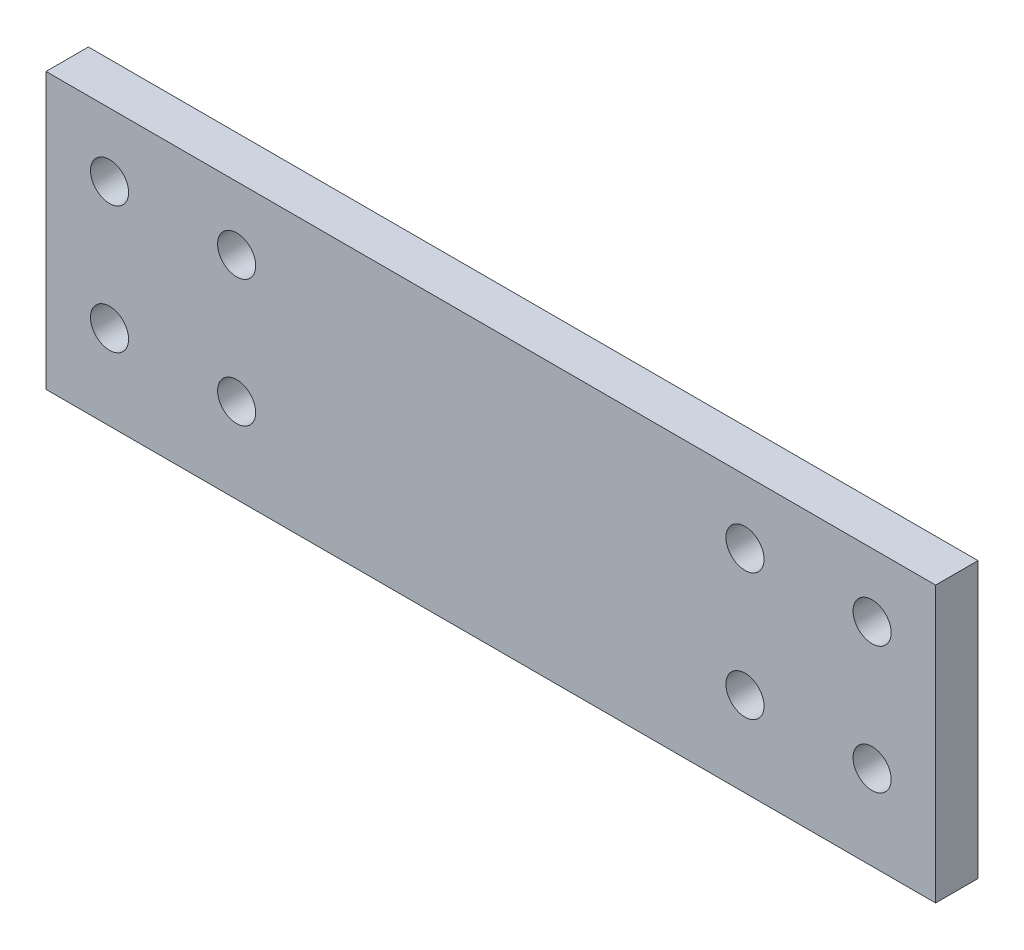
ISO-10303-21;
HEADER;
FILE_DESCRIPTION(('STEP AP214'),'2;1');
FILE_NAME('part.step','',(''),(''),'','','');
FILE_SCHEMA(('AUTOMOTIVE_DESIGN { 1 0 10303 214 1 1 1 1 }'));
ENDSEC;
DATA;
#1=APPLICATION_CONTEXT('core data for automotive mechanical design processes');
#2=APPLICATION_PROTOCOL_DEFINITION('international standard','automotive_design',2000,#1);
#3=PRODUCT_CONTEXT('',#1,'mechanical');
#4=PRODUCT('Part','Part','',(#3));
#5=PRODUCT_RELATED_PRODUCT_CATEGORY('part','',(#4));
#6=PRODUCT_DEFINITION_FORMATION('','',#4);
#7=PRODUCT_DEFINITION_CONTEXT('part definition',#1,'design');
#8=PRODUCT_DEFINITION('design','',#6,#7);
#9=PRODUCT_DEFINITION_SHAPE('','',#8);
#10=(LENGTH_UNIT() NAMED_UNIT(*) SI_UNIT(.MILLI.,.METRE.));
#11=(NAMED_UNIT(*) PLANE_ANGLE_UNIT() SI_UNIT($,.RADIAN.));
#12=(NAMED_UNIT(*) SI_UNIT($,.STERADIAN.) SOLID_ANGLE_UNIT());
#13=UNCERTAINTY_MEASURE_WITH_UNIT(LENGTH_MEASURE(1.E-05),#10,'distance_accuracy_value','');
#14=(GEOMETRIC_REPRESENTATION_CONTEXT(3) GLOBAL_UNCERTAINTY_ASSIGNED_CONTEXT((#13)) GLOBAL_UNIT_ASSIGNED_CONTEXT((#10,
#11,#12)) REPRESENTATION_CONTEXT('',''));
#15=CARTESIAN_POINT('',(0.,0.,0.));
#16=DIRECTION('',(0.,0.,1.));
#17=DIRECTION('',(1.,0.,0.));
#18=AXIS2_PLACEMENT_3D('',#15,#16,#17);
#19=CARTESIAN_POINT('',(-105.,-32.5,10.));
#20=DIRECTION('',(1.,0.,0.));
#21=DIRECTION('',(0.,0.,-1.));
#22=AXIS2_PLACEMENT_3D('',#19,#20,#21);
#23=PLANE('',#22);
#24=DIRECTION('',(0.,-1.,0.));
#25=VECTOR('',#24,1.);
#26=CARTESIAN_POINT('',(-105.,-32.5,0.));
#27=LINE('',#26,#25);
#28=CARTESIAN_POINT('',(-105.,32.5,0.));
#29=VERTEX_POINT('',#28);
#30=CARTESIAN_POINT('',(-105.,-32.5,0.));
#31=VERTEX_POINT('',#30);
#32=EDGE_CURVE('E102',#29,#31,#27,.T.);
#33=ORIENTED_EDGE('',*,*,#32,.T.);
#34=DIRECTION('',(0.,0.,-1.));
#35=VECTOR('',#34,1.);
#36=CARTESIAN_POINT('',(-105.,-32.5,10.));
#37=LINE('',#36,#35);
#38=CARTESIAN_POINT('',(-105.,-32.5,10.));
#39=VERTEX_POINT('',#38);
#40=EDGE_CURVE('E11',#39,#31,#37,.T.);
#41=ORIENTED_EDGE('',*,*,#40,.F.);
#42=DIRECTION('',(0.,-1.,0.));
#43=VECTOR('',#42,1.);
#44=CARTESIAN_POINT('',(-105.,-32.5,10.));
#45=LINE('',#44,#43);
#46=CARTESIAN_POINT('',(-105.,32.5,10.));
#47=VERTEX_POINT('',#46);
#48=EDGE_CURVE('E90',#47,#39,#45,.T.);
#49=ORIENTED_EDGE('',*,*,#48,.F.);
#50=DIRECTION('',(0.,0.,-1.));
#51=VECTOR('',#50,1.);
#52=CARTESIAN_POINT('',(-105.,32.5,10.));
#53=LINE('',#52,#51);
#54=EDGE_CURVE('E98',#47,#29,#53,.T.);
#55=ORIENTED_EDGE('',*,*,#54,.T.);
#56=EDGE_LOOP('',(#33,#41,#49,#55));
#57=FACE_BOUND('',#56,.T.);
#58=ADVANCED_FACE('F39',(#57),#23,.F.);
#59=CARTESIAN_POINT('',(105.,-32.5,10.));
#60=DIRECTION('',(0.,1.,0.));
#61=DIRECTION('',(-1.,0.,0.));
#62=AXIS2_PLACEMENT_3D('',#59,#60,#61);
#63=PLANE('',#62);
#64=DIRECTION('',(1.,0.,0.));
#65=VECTOR('',#64,1.);
#66=CARTESIAN_POINT('',(105.,-32.5,0.));
#67=LINE('',#66,#65);
#68=CARTESIAN_POINT('',(105.,-32.5,0.));
#69=VERTEX_POINT('',#68);
#70=EDGE_CURVE('E94',#31,#69,#67,.T.);
#71=ORIENTED_EDGE('',*,*,#70,.T.);
#72=DIRECTION('',(0.,0.,-1.));
#73=VECTOR('',#72,1.);
#74=CARTESIAN_POINT('',(105.,-32.5,10.));
#75=LINE('',#74,#73);
#76=CARTESIAN_POINT('',(105.,-32.5,10.));
#77=VERTEX_POINT('',#76);
#78=EDGE_CURVE('E47',#77,#69,#75,.T.);
#79=ORIENTED_EDGE('',*,*,#78,.F.);
#80=DIRECTION('',(1.,0.,0.));
#81=VECTOR('',#80,1.);
#82=CARTESIAN_POINT('',(105.,-32.5,10.));
#83=LINE('',#82,#81);
#84=EDGE_CURVE('E85',#39,#77,#83,.T.);
#85=ORIENTED_EDGE('',*,*,#84,.F.);
#86=ORIENTED_EDGE('',*,*,#40,.T.);
#87=EDGE_LOOP('',(#71,#79,#85,#86));
#88=FACE_BOUND('',#87,.T.);
#89=ADVANCED_FACE('F93',(#88),#63,.F.);
#90=CARTESIAN_POINT('',(105.,-32.5,10.));
#91=DIRECTION('',(-1.,0.,0.));
#92=DIRECTION('',(0.,0.,1.));
#93=AXIS2_PLACEMENT_3D('',#90,#91,#92);
#94=PLANE('',#93);
#95=DIRECTION('',(0.,1.,0.));
#96=VECTOR('',#95,1.);
#97=CARTESIAN_POINT('',(105.,-32.5,0.));
#98=LINE('',#97,#96);
#99=CARTESIAN_POINT('',(105.,32.5,0.));
#100=VERTEX_POINT('',#99);
#101=EDGE_CURVE('E72',#69,#100,#98,.T.);
#102=ORIENTED_EDGE('',*,*,#101,.T.);
#103=DIRECTION('',(0.,0.,-1.));
#104=VECTOR('',#103,1.);
#105=CARTESIAN_POINT('',(105.,32.5,10.));
#106=LINE('',#105,#104);
#107=CARTESIAN_POINT('',(105.,32.5,10.));
#108=VERTEX_POINT('',#107);
#109=EDGE_CURVE('E95',#108,#100,#106,.T.);
#110=ORIENTED_EDGE('',*,*,#109,.F.);
#111=DIRECTION('',(0.,1.,0.));
#112=VECTOR('',#111,1.);
#113=CARTESIAN_POINT('',(105.,-32.5,10.));
#114=LINE('',#113,#112);
#115=EDGE_CURVE('E88',#77,#108,#114,.T.);
#116=ORIENTED_EDGE('',*,*,#115,.F.);
#117=ORIENTED_EDGE('',*,*,#78,.T.);
#118=EDGE_LOOP('',(#102,#110,#116,#117));
#119=FACE_BOUND('',#118,.T.);
#120=ADVANCED_FACE('F96',(#119),#94,.F.);
#121=CARTESIAN_POINT('',(105.,32.5,10.));
#122=DIRECTION('',(0.,-1.,0.));
#123=DIRECTION('',(1.,0.,0.));
#124=AXIS2_PLACEMENT_3D('',#121,#122,#123);
#125=PLANE('',#124);
#126=DIRECTION('',(-1.,0.,0.));
#127=VECTOR('',#126,1.);
#128=CARTESIAN_POINT('',(105.,32.5,0.));
#129=LINE('',#128,#127);
#130=EDGE_CURVE('E78',#100,#29,#129,.T.);
#131=ORIENTED_EDGE('',*,*,#130,.T.);
#132=ORIENTED_EDGE('',*,*,#54,.F.);
#133=DIRECTION('',(-1.,0.,0.));
#134=VECTOR('',#133,1.);
#135=CARTESIAN_POINT('',(105.,32.5,10.));
#136=LINE('',#135,#134);
#137=EDGE_CURVE('E55',#108,#47,#136,.T.);
#138=ORIENTED_EDGE('',*,*,#137,.F.);
#139=ORIENTED_EDGE('',*,*,#109,.T.);
#140=EDGE_LOOP('',(#131,#132,#138,#139));
#141=FACE_BOUND('',#140,.T.);
#142=ADVANCED_FACE('F110',(#141),#125,.F.);
#143=CARTESIAN_POINT('',(0.,0.,10.));
#144=DIRECTION('',(0.,0.,1.));
#145=DIRECTION('',(1.,0.,0.));
#146=AXIS2_PLACEMENT_3D('',#143,#144,#145);
#147=PLANE('',#146);
#148=CARTESIAN_POINT('',(60.,17.5,10.));
#149=DIRECTION('',(0.,0.,1.));
#150=DIRECTION('',(1.,0.,0.));
#151=AXIS2_PLACEMENT_3D('',#148,#149,#150);
#152=CIRCLE('',#151,4.5);
#153=CARTESIAN_POINT('',(64.5,17.5,10.));
#154=VERTEX_POINT('',#153);
#155=EDGE_CURVE('E134',#154,#154,#152,.T.);
#156=ORIENTED_EDGE('',*,*,#155,.F.);
#157=EDGE_LOOP('',(#156));
#158=FACE_BOUND('',#157,.T.);
#159=CARTESIAN_POINT('',(-60.,-12.5,10.));
#160=DIRECTION('',(0.,0.,1.));
#161=DIRECTION('',(1.,0.,0.));
#162=AXIS2_PLACEMENT_3D('',#159,#160,#161);
#163=CIRCLE('',#162,4.5);
#164=CARTESIAN_POINT('',(-55.5,-12.5,10.));
#165=VERTEX_POINT('',#164);
#166=EDGE_CURVE('E129',#165,#165,#163,.T.);
#167=ORIENTED_EDGE('',*,*,#166,.F.);
#168=EDGE_LOOP('',(#167));
#169=FACE_BOUND('',#168,.T.);
#170=CARTESIAN_POINT('',(-60.,17.5,10.));
#171=DIRECTION('',(0.,0.,1.));
#172=DIRECTION('',(1.,0.,0.));
#173=AXIS2_PLACEMENT_3D('',#170,#171,#172);
#174=CIRCLE('',#173,4.5);
#175=CARTESIAN_POINT('',(-55.5,17.5,10.));
#176=VERTEX_POINT('',#175);
#177=EDGE_CURVE('E122',#176,#176,#174,.T.);
#178=ORIENTED_EDGE('',*,*,#177,.F.);
#179=EDGE_LOOP('',(#178));
#180=FACE_BOUND('',#179,.T.);
#181=CARTESIAN_POINT('',(-90.,17.5,10.));
#182=DIRECTION('',(0.,0.,1.));
#183=DIRECTION('',(1.,0.,0.));
#184=AXIS2_PLACEMENT_3D('',#181,#182,#183);
#185=CIRCLE('',#184,4.5);
#186=CARTESIAN_POINT('',(-85.5,17.5,10.));
#187=VERTEX_POINT('',#186);
#188=EDGE_CURVE('E121',#187,#187,#185,.T.);
#189=ORIENTED_EDGE('',*,*,#188,.F.);
#190=EDGE_LOOP('',(#189));
#191=FACE_BOUND('',#190,.T.);
#192=CARTESIAN_POINT('',(90.,-12.5,10.));
#193=DIRECTION('',(0.,0.,1.));
#194=DIRECTION('',(1.,0.,0.));
#195=AXIS2_PLACEMENT_3D('',#192,#193,#194);
#196=CIRCLE('',#195,4.5);
#197=CARTESIAN_POINT('',(94.5,-12.5,10.));
#198=VERTEX_POINT('',#197);
#199=EDGE_CURVE('E153',#198,#198,#196,.T.);
#200=ORIENTED_EDGE('',*,*,#199,.F.);
#201=EDGE_LOOP('',(#200));
#202=FACE_BOUND('',#201,.T.);
#203=CARTESIAN_POINT('',(60.,-12.5,10.));
#204=DIRECTION('',(0.,0.,1.));
#205=DIRECTION('',(1.,0.,0.));
#206=AXIS2_PLACEMENT_3D('',#203,#204,#205);
#207=CIRCLE('',#206,4.5);
#208=CARTESIAN_POINT('',(64.5,-12.5,10.));
#209=VERTEX_POINT('',#208);
#210=EDGE_CURVE('E146',#209,#209,#207,.T.);
#211=ORIENTED_EDGE('',*,*,#210,.F.);
#212=EDGE_LOOP('',(#211));
#213=FACE_BOUND('',#212,.T.);
#214=CARTESIAN_POINT('',(90.,17.5,10.));
#215=DIRECTION('',(0.,0.,1.));
#216=DIRECTION('',(1.,0.,0.));
#217=AXIS2_PLACEMENT_3D('',#214,#215,#216);
#218=CIRCLE('',#217,4.5);
#219=CARTESIAN_POINT('',(94.5,17.5,10.));
#220=VERTEX_POINT('',#219);
#221=EDGE_CURVE('E141',#220,#220,#218,.T.);
#222=ORIENTED_EDGE('',*,*,#221,.F.);
#223=EDGE_LOOP('',(#222));
#224=FACE_BOUND('',#223,.T.);
#225=CARTESIAN_POINT('',(-90.,-12.5,10.));
#226=DIRECTION('',(0.,0.,1.));
#227=DIRECTION('',(1.,0.,0.));
#228=AXIS2_PLACEMENT_3D('',#225,#226,#227);
#229=CIRCLE('',#228,4.5);
#230=CARTESIAN_POINT('',(-85.5,-12.5,10.));
#231=VERTEX_POINT('',#230);
#232=EDGE_CURVE('E118',#231,#231,#229,.T.);
#233=ORIENTED_EDGE('',*,*,#232,.F.);
#234=EDGE_LOOP('',(#233));
#235=FACE_BOUND('',#234,.T.);
#236=ORIENTED_EDGE('',*,*,#48,.T.);
#237=ORIENTED_EDGE('',*,*,#84,.T.);
#238=ORIENTED_EDGE('',*,*,#115,.T.);
#239=ORIENTED_EDGE('',*,*,#137,.T.);
#240=EDGE_LOOP('',(#236,#237,#238,#239));
#241=FACE_BOUND('',#240,.T.);
#242=ADVANCED_FACE('F86',(#158,#169,#180,#191,#202,#213,#224,#235,#241),#147,.T.);
#243=CARTESIAN_POINT('',(0.,0.,0.));
#244=DIRECTION('',(0.,0.,1.));
#245=DIRECTION('',(1.,0.,0.));
#246=AXIS2_PLACEMENT_3D('',#243,#244,#245);
#247=PLANE('',#246);
#248=CARTESIAN_POINT('',(60.,17.5,0.));
#249=DIRECTION('',(0.,0.,1.));
#250=DIRECTION('',(1.,0.,0.));
#251=AXIS2_PLACEMENT_3D('',#248,#249,#250);
#252=CIRCLE('',#251,4.5);
#253=CARTESIAN_POINT('',(64.5,17.5,0.));
#254=VERTEX_POINT('',#253);
#255=EDGE_CURVE('E138',#254,#254,#252,.F.);
#256=ORIENTED_EDGE('',*,*,#255,.F.);
#257=EDGE_LOOP('',(#256));
#258=FACE_BOUND('',#257,.T.);
#259=CARTESIAN_POINT('',(-60.,-12.5,0.));
#260=DIRECTION('',(0.,0.,1.));
#261=DIRECTION('',(1.,0.,0.));
#262=AXIS2_PLACEMENT_3D('',#259,#260,#261);
#263=CIRCLE('',#262,4.5);
#264=CARTESIAN_POINT('',(-55.5,-12.5,0.));
#265=VERTEX_POINT('',#264);
#266=EDGE_CURVE('E137',#265,#265,#263,.F.);
#267=ORIENTED_EDGE('',*,*,#266,.F.);
#268=EDGE_LOOP('',(#267));
#269=FACE_BOUND('',#268,.T.);
#270=CARTESIAN_POINT('',(-60.,17.5,0.));
#271=DIRECTION('',(0.,0.,1.));
#272=DIRECTION('',(1.,0.,0.));
#273=AXIS2_PLACEMENT_3D('',#270,#271,#272);
#274=CIRCLE('',#273,4.5);
#275=CARTESIAN_POINT('',(-55.5,17.5,0.));
#276=VERTEX_POINT('',#275);
#277=EDGE_CURVE('E126',#276,#276,#274,.F.);
#278=ORIENTED_EDGE('',*,*,#277,.F.);
#279=EDGE_LOOP('',(#278));
#280=FACE_BOUND('',#279,.T.);
#281=CARTESIAN_POINT('',(-90.,17.5,0.));
#282=DIRECTION('',(0.,0.,1.));
#283=DIRECTION('',(1.,0.,0.));
#284=AXIS2_PLACEMENT_3D('',#281,#282,#283);
#285=CIRCLE('',#284,4.5);
#286=CARTESIAN_POINT('',(-85.5,17.5,0.));
#287=VERTEX_POINT('',#286);
#288=EDGE_CURVE('E125',#287,#287,#285,.F.);
#289=ORIENTED_EDGE('',*,*,#288,.F.);
#290=EDGE_LOOP('',(#289));
#291=FACE_BOUND('',#290,.T.);
#292=CARTESIAN_POINT('',(90.,-12.5,0.));
#293=DIRECTION('',(0.,0.,1.));
#294=DIRECTION('',(1.,0.,0.));
#295=AXIS2_PLACEMENT_3D('',#292,#293,#294);
#296=CIRCLE('',#295,4.5);
#297=CARTESIAN_POINT('',(94.5,-12.5,0.));
#298=VERTEX_POINT('',#297);
#299=EDGE_CURVE('E160',#298,#298,#296,.F.);
#300=ORIENTED_EDGE('',*,*,#299,.F.);
#301=EDGE_LOOP('',(#300));
#302=FACE_BOUND('',#301,.T.);
#303=CARTESIAN_POINT('',(60.,-12.5,0.));
#304=DIRECTION('',(0.,0.,1.));
#305=DIRECTION('',(1.,0.,0.));
#306=AXIS2_PLACEMENT_3D('',#303,#304,#305);
#307=CIRCLE('',#306,4.5);
#308=CARTESIAN_POINT('',(64.5,-12.5,0.));
#309=VERTEX_POINT('',#308);
#310=EDGE_CURVE('E150',#309,#309,#307,.F.);
#311=ORIENTED_EDGE('',*,*,#310,.F.);
#312=EDGE_LOOP('',(#311));
#313=FACE_BOUND('',#312,.T.);
#314=CARTESIAN_POINT('',(90.,17.5,0.));
#315=DIRECTION('',(0.,0.,1.));
#316=DIRECTION('',(1.,0.,0.));
#317=AXIS2_PLACEMENT_3D('',#314,#315,#316);
#318=CIRCLE('',#317,4.5);
#319=CARTESIAN_POINT('',(94.5,17.5,0.));
#320=VERTEX_POINT('',#319);
#321=EDGE_CURVE('E149',#320,#320,#318,.F.);
#322=ORIENTED_EDGE('',*,*,#321,.F.);
#323=EDGE_LOOP('',(#322));
#324=FACE_BOUND('',#323,.T.);
#325=CARTESIAN_POINT('',(-90.,-12.5,0.));
#326=DIRECTION('',(0.,0.,1.));
#327=DIRECTION('',(1.,0.,0.));
#328=AXIS2_PLACEMENT_3D('',#325,#326,#327);
#329=CIRCLE('',#328,4.5);
#330=CARTESIAN_POINT('',(-85.5,-12.5,0.));
#331=VERTEX_POINT('',#330);
#332=EDGE_CURVE('E105',#331,#331,#329,.F.);
#333=ORIENTED_EDGE('',*,*,#332,.F.);
#334=EDGE_LOOP('',(#333));
#335=FACE_BOUND('',#334,.T.);
#336=ORIENTED_EDGE('',*,*,#32,.F.);
#337=ORIENTED_EDGE('',*,*,#130,.F.);
#338=ORIENTED_EDGE('',*,*,#101,.F.);
#339=ORIENTED_EDGE('',*,*,#70,.F.);
#340=EDGE_LOOP('',(#336,#337,#338,#339));
#341=FACE_BOUND('',#340,.T.);
#342=ADVANCED_FACE('F113',(#258,#269,#280,#291,#302,#313,#324,#335,#341),#247,.F.);
#343=CARTESIAN_POINT('',(-90.,-12.5,-0.000999999999999265));
#344=DIRECTION('',(0.,0.,1.));
#345=DIRECTION('',(1.,0.,0.));
#346=AXIS2_PLACEMENT_3D('',#343,#344,#345);
#347=CYLINDRICAL_SURFACE('',#346,4.5);
#348=ORIENTED_EDGE('',*,*,#232,.T.);
#349=EDGE_LOOP('',(#348));
#350=FACE_BOUND('',#349,.T.);
#351=ORIENTED_EDGE('',*,*,#332,.T.);
#352=EDGE_LOOP('',(#351));
#353=FACE_BOUND('',#352,.T.);
#354=ADVANCED_FACE('F168',(#350,#353),#347,.F.);
#355=CARTESIAN_POINT('',(90.,17.5,-0.000999999999999265));
#356=DIRECTION('',(0.,0.,1.));
#357=DIRECTION('',(1.,0.,0.));
#358=AXIS2_PLACEMENT_3D('',#355,#356,#357);
#359=CYLINDRICAL_SURFACE('',#358,4.5);
#360=ORIENTED_EDGE('',*,*,#221,.T.);
#361=EDGE_LOOP('',(#360));
#362=FACE_BOUND('',#361,.T.);
#363=ORIENTED_EDGE('',*,*,#321,.T.);
#364=EDGE_LOOP('',(#363));
#365=FACE_BOUND('',#364,.T.);
#366=ADVANCED_FACE('F178',(#362,#365),#359,.F.);
#367=CARTESIAN_POINT('',(60.,-12.5,-0.000999999999999265));
#368=DIRECTION('',(0.,0.,1.));
#369=DIRECTION('',(1.,0.,0.));
#370=AXIS2_PLACEMENT_3D('',#367,#368,#369);
#371=CYLINDRICAL_SURFACE('',#370,4.5);
#372=ORIENTED_EDGE('',*,*,#210,.T.);
#373=EDGE_LOOP('',(#372));
#374=FACE_BOUND('',#373,.T.);
#375=ORIENTED_EDGE('',*,*,#310,.T.);
#376=EDGE_LOOP('',(#375));
#377=FACE_BOUND('',#376,.T.);
#378=ADVANCED_FACE('F184',(#374,#377),#371,.F.);
#379=CARTESIAN_POINT('',(90.,-12.5,-0.000999999999999265));
#380=DIRECTION('',(0.,0.,1.));
#381=DIRECTION('',(1.,0.,0.));
#382=AXIS2_PLACEMENT_3D('',#379,#380,#381);
#383=CYLINDRICAL_SURFACE('',#382,4.5);
#384=ORIENTED_EDGE('',*,*,#199,.T.);
#385=EDGE_LOOP('',(#384));
#386=FACE_BOUND('',#385,.T.);
#387=ORIENTED_EDGE('',*,*,#299,.T.);
#388=EDGE_LOOP('',(#387));
#389=FACE_BOUND('',#388,.T.);
#390=ADVANCED_FACE('F164',(#386,#389),#383,.F.);
#391=CARTESIAN_POINT('',(-90.,17.5,-0.000999999999999265));
#392=DIRECTION('',(0.,0.,1.));
#393=DIRECTION('',(1.,0.,0.));
#394=AXIS2_PLACEMENT_3D('',#391,#392,#393);
#395=CYLINDRICAL_SURFACE('',#394,4.5);
#396=ORIENTED_EDGE('',*,*,#188,.T.);
#397=EDGE_LOOP('',(#396));
#398=FACE_BOUND('',#397,.T.);
#399=ORIENTED_EDGE('',*,*,#288,.T.);
#400=EDGE_LOOP('',(#399));
#401=FACE_BOUND('',#400,.T.);
#402=ADVANCED_FACE('F226',(#398,#401),#395,.F.);
#403=CARTESIAN_POINT('',(-60.,17.5,-0.000999999999999265));
#404=DIRECTION('',(0.,0.,1.));
#405=DIRECTION('',(1.,0.,0.));
#406=AXIS2_PLACEMENT_3D('',#403,#404,#405);
#407=CYLINDRICAL_SURFACE('',#406,4.5);
#408=ORIENTED_EDGE('',*,*,#177,.T.);
#409=EDGE_LOOP('',(#408));
#410=FACE_BOUND('',#409,.T.);
#411=ORIENTED_EDGE('',*,*,#277,.T.);
#412=EDGE_LOOP('',(#411));
#413=FACE_BOUND('',#412,.T.);
#414=ADVANCED_FACE('F234',(#410,#413),#407,.F.);
#415=CARTESIAN_POINT('',(-60.,-12.5,-0.000999999999999265));
#416=DIRECTION('',(0.,0.,1.));
#417=DIRECTION('',(1.,0.,0.));
#418=AXIS2_PLACEMENT_3D('',#415,#416,#417);
#419=CYLINDRICAL_SURFACE('',#418,4.5);
#420=ORIENTED_EDGE('',*,*,#166,.T.);
#421=EDGE_LOOP('',(#420));
#422=FACE_BOUND('',#421,.T.);
#423=ORIENTED_EDGE('',*,*,#266,.T.);
#424=EDGE_LOOP('',(#423));
#425=FACE_BOUND('',#424,.T.);
#426=ADVANCED_FACE('F230',(#422,#425),#419,.F.);
#427=CARTESIAN_POINT('',(60.,17.5,-0.000999999999999265));
#428=DIRECTION('',(0.,0.,1.));
#429=DIRECTION('',(1.,0.,0.));
#430=AXIS2_PLACEMENT_3D('',#427,#428,#429);
#431=CYLINDRICAL_SURFACE('',#430,4.5);
#432=ORIENTED_EDGE('',*,*,#155,.T.);
#433=EDGE_LOOP('',(#432));
#434=FACE_BOUND('',#433,.T.);
#435=ORIENTED_EDGE('',*,*,#255,.T.);
#436=EDGE_LOOP('',(#435));
#437=FACE_BOUND('',#436,.T.);
#438=ADVANCED_FACE('F233',(#434,#437),#431,.F.);
#439=CLOSED_SHELL('',(#58,#89,#120,#142,#242,#342,#354,#366,#378,#390,#402,#414,#426,#438));
#440=MANIFOLD_SOLID_BREP('B2',#439);
#441=ADVANCED_BREP_SHAPE_REPRESENTATION('',(#18,#440),#14);
#442=SHAPE_DEFINITION_REPRESENTATION(#9,#441);
ENDSEC;
END-ISO-10303-21;
